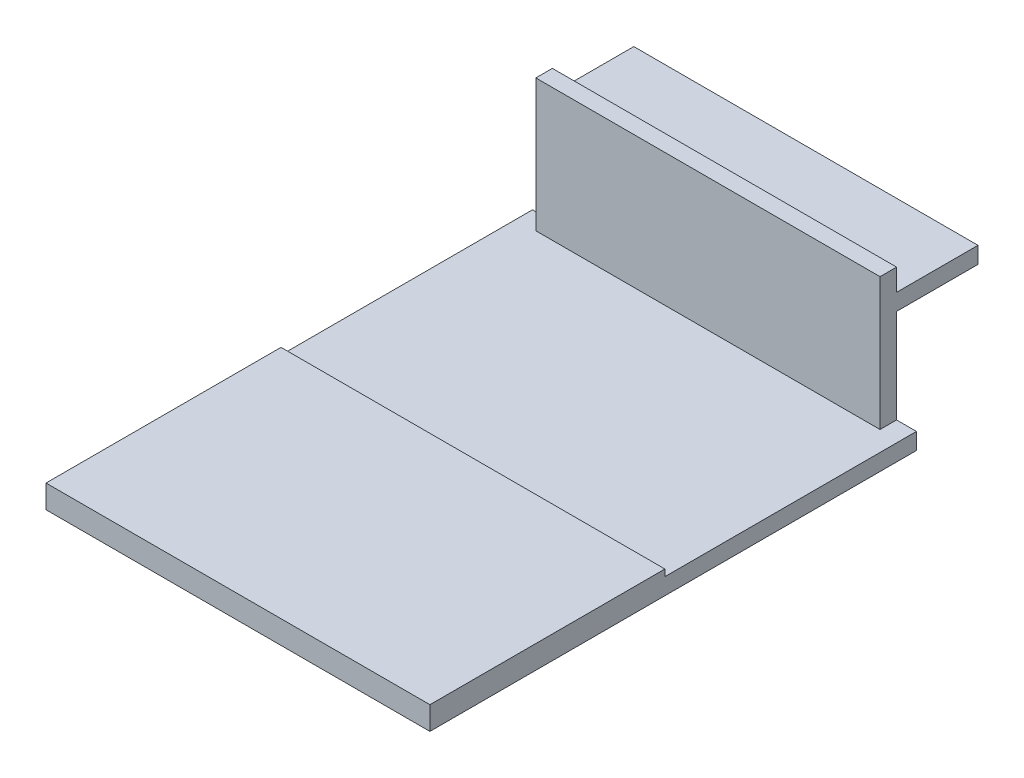
ISO-10303-21;
HEADER;
FILE_DESCRIPTION(('STEP AP214'),'2;1');
FILE_NAME('part.step','',(''),(''),'','','');
FILE_SCHEMA(('AUTOMOTIVE_DESIGN { 1 0 10303 214 1 1 1 1 }'));
ENDSEC;
DATA;
#1=APPLICATION_CONTEXT('core data for automotive mechanical design processes');
#2=APPLICATION_PROTOCOL_DEFINITION('international standard','automotive_design',2000,#1);
#3=PRODUCT_CONTEXT('',#1,'mechanical');
#4=PRODUCT('Part','Part','',(#3));
#5=PRODUCT_RELATED_PRODUCT_CATEGORY('part','',(#4));
#6=PRODUCT_DEFINITION_FORMATION('','',#4);
#7=PRODUCT_DEFINITION_CONTEXT('part definition',#1,'design');
#8=PRODUCT_DEFINITION('design','',#6,#7);
#9=PRODUCT_DEFINITION_SHAPE('','',#8);
#10=(LENGTH_UNIT() NAMED_UNIT(*) SI_UNIT(.MILLI.,.METRE.));
#11=(NAMED_UNIT(*) PLANE_ANGLE_UNIT() SI_UNIT($,.RADIAN.));
#12=(NAMED_UNIT(*) SI_UNIT($,.STERADIAN.) SOLID_ANGLE_UNIT());
#13=UNCERTAINTY_MEASURE_WITH_UNIT(LENGTH_MEASURE(1.E-05),#10,'distance_accuracy_value','');
#14=(GEOMETRIC_REPRESENTATION_CONTEXT(3) GLOBAL_UNCERTAINTY_ASSIGNED_CONTEXT((#13)) GLOBAL_UNIT_ASSIGNED_CONTEXT((#10,
#11,#12)) REPRESENTATION_CONTEXT('',''));
#15=CARTESIAN_POINT('',(0.,0.,0.));
#16=DIRECTION('',(0.,0.,1.));
#17=DIRECTION('',(1.,0.,0.));
#18=AXIS2_PLACEMENT_3D('',#15,#16,#17);
#19=CARTESIAN_POINT('',(-30.1473217032537,-33.3302843760966,186.69));
#20=DIRECTION('',(0.,-1.,0.));
#21=DIRECTION('',(0.,0.,-1.));
#22=AXIS2_PLACEMENT_3D('',#19,#20,#21);
#23=PLANE('',#22);
#24=DIRECTION('',(-1.,0.,0.));
#25=VECTOR('',#24,1.);
#26=CARTESIAN_POINT('',(-37.7673217032537,-33.3302843760966,96.52));
#27=LINE('',#26,#25);
#28=CARTESIAN_POINT('',(109.552678296746,-33.3302843760966,96.52));
#29=VERTEX_POINT('',#28);
#30=CARTESIAN_POINT('',(-37.7673217032537,-33.3302843760966,96.52));
#31=VERTEX_POINT('',#30);
#32=EDGE_CURVE('E173',#29,#31,#27,.T.);
#33=ORIENTED_EDGE('',*,*,#32,.F.);
#34=DIRECTION('',(0.,0.,1.));
#35=VECTOR('',#34,1.);
#36=CARTESIAN_POINT('',(109.552678296746,-33.3302843760966,0.));
#37=LINE('',#36,#35);
#38=CARTESIAN_POINT('',(109.552678296746,-33.3302843760966,0.));
#39=VERTEX_POINT('',#38);
#40=EDGE_CURVE('E191',#39,#29,#37,.T.);
#41=ORIENTED_EDGE('',*,*,#40,.F.);
#42=DIRECTION('',(1.,0.,0.));
#43=VECTOR('',#42,1.);
#44=CARTESIAN_POINT('',(101.932678296746,-33.3302843760966,0.));
#45=LINE('',#44,#43);
#46=CARTESIAN_POINT('',(101.932678296746,-33.3302843760966,0.));
#47=VERTEX_POINT('',#46);
#48=EDGE_CURVE('E56',#47,#39,#45,.T.);
#49=ORIENTED_EDGE('',*,*,#48,.F.);
#50=DIRECTION('',(0.,0.,-1.));
#51=VECTOR('',#50,1.);
#52=CARTESIAN_POINT('',(101.932678296746,-33.3302843760966,0.));
#53=LINE('',#52,#51);
#54=CARTESIAN_POINT('',(101.932678296746,-33.3302843760966,6.35));
#55=VERTEX_POINT('',#54);
#56=EDGE_CURVE('E11',#55,#47,#53,.T.);
#57=ORIENTED_EDGE('',*,*,#56,.F.);
#58=DIRECTION('',(-1.,0.,0.));
#59=VECTOR('',#58,1.);
#60=CARTESIAN_POINT('',(-30.1473217032537,-33.3302843760966,6.35));
#61=LINE('',#60,#59);
#62=CARTESIAN_POINT('',(-30.1473217032537,-33.3302843760966,6.35));
#63=VERTEX_POINT('',#62);
#64=EDGE_CURVE('E216',#55,#63,#61,.T.);
#65=ORIENTED_EDGE('',*,*,#64,.T.);
#66=DIRECTION('',(0.,0.,1.));
#67=VECTOR('',#66,1.);
#68=CARTESIAN_POINT('',(-30.1473217032537,-33.3302843760966,0.));
#69=LINE('',#68,#67);
#70=CARTESIAN_POINT('',(-30.1473217032537,-33.3302843760966,0.));
#71=VERTEX_POINT('',#70);
#72=EDGE_CURVE('E204',#71,#63,#69,.T.);
#73=ORIENTED_EDGE('',*,*,#72,.F.);
#74=DIRECTION('',(1.,0.,0.));
#75=VECTOR('',#74,1.);
#76=CARTESIAN_POINT('',(-30.1473217032537,-33.3302843760966,0.));
#77=LINE('',#76,#75);
#78=CARTESIAN_POINT('',(-37.7673217032537,-33.3302843760966,0.));
#79=VERTEX_POINT('',#78);
#80=EDGE_CURVE('E156',#79,#71,#77,.T.);
#81=ORIENTED_EDGE('',*,*,#80,.F.);
#82=DIRECTION('',(0.,0.,-1.));
#83=VECTOR('',#82,1.);
#84=CARTESIAN_POINT('',(-37.7673217032537,-33.3302843760966,0.));
#85=LINE('',#84,#83);
#86=EDGE_CURVE('E207',#31,#79,#85,.T.);
#87=ORIENTED_EDGE('',*,*,#86,.F.);
#88=EDGE_LOOP('',(#33,#41,#49,#57,#65,#73,#81,#87));
#89=FACE_BOUND('',#88,.T.);
#90=ADVANCED_FACE('F39',(#89),#23,.F.);
#91=CARTESIAN_POINT('',(0.,0.,0.));
#92=DIRECTION('',(0.,0.,1.));
#93=DIRECTION('',(1.,0.,0.));
#94=AXIS2_PLACEMENT_3D('',#91,#92,#93);
#95=PLANE('',#94);
#96=DIRECTION('',(1.,0.,0.));
#97=VECTOR('',#96,1.);
#98=CARTESIAN_POINT('',(101.932678296746,9.08771562390343,0.));
#99=LINE('',#98,#97);
#100=CARTESIAN_POINT('',(-30.1473217032537,9.08771562390343,0.));
#101=VERTEX_POINT('',#100);
#102=CARTESIAN_POINT('',(101.932678296746,9.08771562390343,0.));
#103=VERTEX_POINT('',#102);
#104=EDGE_CURVE('E229',#101,#103,#99,.T.);
#105=ORIENTED_EDGE('',*,*,#104,.F.);
#106=DIRECTION('',(0.,-1.,0.));
#107=VECTOR('',#106,1.);
#108=CARTESIAN_POINT('',(-30.1473217032537,17.4697156239034,0.));
#109=LINE('',#108,#107);
#110=CARTESIAN_POINT('',(-30.1473217032537,17.4697156239034,0.));
#111=VERTEX_POINT('',#110);
#112=EDGE_CURVE('E271',#111,#101,#109,.T.);
#113=ORIENTED_EDGE('',*,*,#112,.F.);
#114=DIRECTION('',(-1.,0.,0.));
#115=VECTOR('',#114,1.);
#116=CARTESIAN_POINT('',(-30.1473217032537,17.4697156239034,0.));
#117=LINE('',#116,#115);
#118=CARTESIAN_POINT('',(101.932678296746,17.4697156239034,0.));
#119=VERTEX_POINT('',#118);
#120=EDGE_CURVE('E264',#119,#111,#117,.T.);
#121=ORIENTED_EDGE('',*,*,#120,.F.);
#122=DIRECTION('',(0.,1.,0.));
#123=VECTOR('',#122,1.);
#124=CARTESIAN_POINT('',(101.932678296746,17.4697156239034,0.));
#125=LINE('',#124,#123);
#126=EDGE_CURVE('E278',#103,#119,#125,.T.);
#127=ORIENTED_EDGE('',*,*,#126,.F.);
#128=EDGE_LOOP('',(#105,#113,#121,#127));
#129=FACE_BOUND('',#128,.T.);
#130=ADVANCED_FACE('F298',(#129),#95,.F.);
#131=DIRECTION('',(-1.,0.,0.));
#132=VECTOR('',#131,1.);
#133=CARTESIAN_POINT('',(101.932678296746,2.73771562390344,0.));
#134=LINE('',#133,#132);
#135=CARTESIAN_POINT('',(101.932678296746,2.73771562390344,0.));
#136=VERTEX_POINT('',#135);
#137=CARTESIAN_POINT('',(-30.1473217032537,2.73771562390344,0.));
#138=VERTEX_POINT('',#137);
#139=EDGE_CURVE('E221',#136,#138,#134,.T.);
#140=ORIENTED_EDGE('',*,*,#139,.F.);
#141=EDGE_CURVE('E279',#47,#136,#125,.T.);
#142=ORIENTED_EDGE('',*,*,#141,.F.);
#143=ORIENTED_EDGE('',*,*,#48,.T.);
#144=DIRECTION('',(0.,-1.,0.));
#145=VECTOR('',#144,1.);
#146=CARTESIAN_POINT('',(109.552678296746,-33.3302843760966,0.));
#147=LINE('',#146,#145);
#148=CARTESIAN_POINT('',(109.552678296746,-39.6802843760966,0.));
#149=VERTEX_POINT('',#148);
#150=EDGE_CURVE('E195',#39,#149,#147,.T.);
#151=ORIENTED_EDGE('',*,*,#150,.T.);
#152=DIRECTION('',(1.,0.,0.));
#153=VECTOR('',#152,1.);
#154=CARTESIAN_POINT('',(-30.1473217032537,-39.6802843760966,0.));
#155=LINE('',#154,#153);
#156=CARTESIAN_POINT('',(-37.7673217032537,-39.6802843760966,0.));
#157=VERTEX_POINT('',#156);
#158=EDGE_CURVE('E275',#157,#149,#155,.T.);
#159=ORIENTED_EDGE('',*,*,#158,.F.);
#160=DIRECTION('',(0.,-1.,0.));
#161=VECTOR('',#160,1.);
#162=CARTESIAN_POINT('',(-37.7673217032537,-33.3302843760966,0.));
#163=LINE('',#162,#161);
#164=EDGE_CURVE('E155',#79,#157,#163,.T.);
#165=ORIENTED_EDGE('',*,*,#164,.F.);
#166=ORIENTED_EDGE('',*,*,#80,.T.);
#167=EDGE_CURVE('E63',#138,#71,#109,.T.);
#168=ORIENTED_EDGE('',*,*,#167,.F.);
#169=EDGE_LOOP('',(#140,#142,#143,#151,#159,#165,#166,#168));
#170=FACE_BOUND('',#169,.T.);
#171=ADVANCED_FACE('F315',(#170),#95,.F.);
#172=CARTESIAN_POINT('',(-30.1473217032537,17.4697156239034,6.35));
#173=DIRECTION('',(1.,0.,0.));
#174=DIRECTION('',(0.,1.,0.));
#175=AXIS2_PLACEMENT_3D('',#172,#173,#174);
#176=PLANE('',#175);
#177=ORIENTED_EDGE('',*,*,#167,.T.);
#178=ORIENTED_EDGE('',*,*,#72,.T.);
#179=DIRECTION('',(0.,-1.,0.));
#180=VECTOR('',#179,1.);
#181=CARTESIAN_POINT('',(-30.1473217032537,17.4697156239034,6.35));
#182=LINE('',#181,#180);
#183=CARTESIAN_POINT('',(-30.1473217032537,17.4697156239034,6.35));
#184=VERTEX_POINT('',#183);
#185=EDGE_CURVE('E259',#184,#63,#182,.T.);
#186=ORIENTED_EDGE('',*,*,#185,.F.);
#187=DIRECTION('',(0.,0.,-1.));
#188=VECTOR('',#187,1.);
#189=CARTESIAN_POINT('',(-30.1473217032537,17.4697156239034,6.35));
#190=LINE('',#189,#188);
#191=EDGE_CURVE('E270',#184,#111,#190,.T.);
#192=ORIENTED_EDGE('',*,*,#191,.T.);
#193=ORIENTED_EDGE('',*,*,#112,.T.);
#194=DIRECTION('',(0.,0.,1.));
#195=VECTOR('',#194,1.);
#196=CARTESIAN_POINT('',(-30.1473217032537,9.08771562390343,-31.242));
#197=LINE('',#196,#195);
#198=CARTESIAN_POINT('',(-30.1473217032537,9.08771562390343,-31.242));
#199=VERTEX_POINT('',#198);
#200=EDGE_CURVE('E248',#199,#101,#197,.T.);
#201=ORIENTED_EDGE('',*,*,#200,.F.);
#202=DIRECTION('',(0.,1.,0.));
#203=VECTOR('',#202,1.);
#204=CARTESIAN_POINT('',(-30.1473217032537,2.73771562390344,-31.242));
#205=LINE('',#204,#203);
#206=CARTESIAN_POINT('',(-30.1473217032537,2.73771562390344,-31.242));
#207=VERTEX_POINT('',#206);
#208=EDGE_CURVE('E232',#207,#199,#205,.T.);
#209=ORIENTED_EDGE('',*,*,#208,.F.);
#210=DIRECTION('',(0.,0.,1.));
#211=VECTOR('',#210,1.);
#212=CARTESIAN_POINT('',(-30.1473217032537,2.73771562390344,-31.242));
#213=LINE('',#212,#211);
#214=EDGE_CURVE('E252',#207,#138,#213,.T.);
#215=ORIENTED_EDGE('',*,*,#214,.T.);
#216=EDGE_LOOP('',(#177,#178,#186,#192,#193,#201,#209,#215));
#217=FACE_BOUND('',#216,.T.);
#218=ADVANCED_FACE('F41',(#217),#176,.F.);
#219=CARTESIAN_POINT('',(-30.1473217032537,-39.6802843760966,6.35));
#220=DIRECTION('',(0.,1.,0.));
#221=DIRECTION('',(0.,0.,1.));
#222=AXIS2_PLACEMENT_3D('',#219,#220,#221);
#223=PLANE('',#222);
#224=ORIENTED_EDGE('',*,*,#158,.T.);
#225=DIRECTION('',(0.,0.,1.));
#226=VECTOR('',#225,1.);
#227=CARTESIAN_POINT('',(109.552678296746,-39.6802843760966,0.));
#228=LINE('',#227,#226);
#229=CARTESIAN_POINT('',(109.552678296746,-39.6802843760966,186.69));
#230=VERTEX_POINT('',#229);
#231=EDGE_CURVE('E187',#149,#230,#228,.T.);
#232=ORIENTED_EDGE('',*,*,#231,.T.);
#233=DIRECTION('',(1.,0.,0.));
#234=VECTOR('',#233,1.);
#235=CARTESIAN_POINT('',(-30.1473217032537,-39.6802843760966,186.69));
#236=LINE('',#235,#234);
#237=CARTESIAN_POINT('',(-37.7673217032537,-39.6802843760966,186.69));
#238=VERTEX_POINT('',#237);
#239=EDGE_CURVE('E218',#238,#230,#236,.T.);
#240=ORIENTED_EDGE('',*,*,#239,.F.);
#241=DIRECTION('',(0.,0.,-1.));
#242=VECTOR('',#241,1.);
#243=CARTESIAN_POINT('',(-37.7673217032537,-39.6802843760966,0.));
#244=LINE('',#243,#242);
#245=EDGE_CURVE('E152',#238,#157,#244,.T.);
#246=ORIENTED_EDGE('',*,*,#245,.T.);
#247=EDGE_LOOP('',(#224,#232,#240,#246));
#248=FACE_BOUND('',#247,.T.);
#249=ADVANCED_FACE('F328',(#248),#223,.F.);
#250=CARTESIAN_POINT('',(101.932678296746,17.4697156239034,6.35));
#251=DIRECTION('',(-1.,0.,0.));
#252=DIRECTION('',(0.,0.,1.));
#253=AXIS2_PLACEMENT_3D('',#250,#251,#252);
#254=PLANE('',#253);
#255=DIRECTION('',(0.,1.,0.));
#256=VECTOR('',#255,1.);
#257=CARTESIAN_POINT('',(101.932678296746,17.4697156239034,6.35));
#258=LINE('',#257,#256);
#259=CARTESIAN_POINT('',(101.932678296746,17.4697156239034,6.35));
#260=VERTEX_POINT('',#259);
#261=EDGE_CURVE('E263',#55,#260,#258,.T.);
#262=ORIENTED_EDGE('',*,*,#261,.F.);
#263=ORIENTED_EDGE('',*,*,#56,.T.);
#264=ORIENTED_EDGE('',*,*,#141,.T.);
#265=DIRECTION('',(0.,0.,1.));
#266=VECTOR('',#265,1.);
#267=CARTESIAN_POINT('',(101.932678296746,2.73771562390344,-31.242));
#268=LINE('',#267,#266);
#269=CARTESIAN_POINT('',(101.932678296746,2.73771562390344,-31.242));
#270=VERTEX_POINT('',#269);
#271=EDGE_CURVE('E255',#270,#136,#268,.T.);
#272=ORIENTED_EDGE('',*,*,#271,.F.);
#273=DIRECTION('',(0.,-1.,0.));
#274=VECTOR('',#273,1.);
#275=CARTESIAN_POINT('',(101.932678296746,2.73771562390344,-31.242));
#276=LINE('',#275,#274);
#277=CARTESIAN_POINT('',(101.932678296746,9.08771562390343,-31.242));
#278=VERTEX_POINT('',#277);
#279=EDGE_CURVE('E224',#278,#270,#276,.T.);
#280=ORIENTED_EDGE('',*,*,#279,.F.);
#281=DIRECTION('',(0.,0.,1.));
#282=VECTOR('',#281,1.);
#283=CARTESIAN_POINT('',(101.932678296746,9.08771562390343,-31.242));
#284=LINE('',#283,#282);
#285=EDGE_CURVE('E238',#278,#103,#284,.T.);
#286=ORIENTED_EDGE('',*,*,#285,.T.);
#287=ORIENTED_EDGE('',*,*,#126,.T.);
#288=DIRECTION('',(0.,0.,-1.));
#289=VECTOR('',#288,1.);
#290=CARTESIAN_POINT('',(101.932678296746,17.4697156239034,6.35));
#291=LINE('',#290,#289);
#292=EDGE_CURVE('E43',#260,#119,#291,.T.);
#293=ORIENTED_EDGE('',*,*,#292,.F.);
#294=EDGE_LOOP('',(#262,#263,#264,#272,#280,#286,#287,#293));
#295=FACE_BOUND('',#294,.T.);
#296=ADVANCED_FACE('F320',(#295),#254,.F.);
#297=CARTESIAN_POINT('',(-30.1473217032537,17.4697156239034,6.35));
#298=DIRECTION('',(0.,-1.,0.));
#299=DIRECTION('',(0.,0.,-1.));
#300=AXIS2_PLACEMENT_3D('',#297,#298,#299);
#301=PLANE('',#300);
#302=ORIENTED_EDGE('',*,*,#120,.T.);
#303=ORIENTED_EDGE('',*,*,#191,.F.);
#304=DIRECTION('',(-1.,0.,0.));
#305=VECTOR('',#304,1.);
#306=CARTESIAN_POINT('',(-30.1473217032537,17.4697156239034,6.35));
#307=LINE('',#306,#305);
#308=EDGE_CURVE('E267',#260,#184,#307,.T.);
#309=ORIENTED_EDGE('',*,*,#308,.F.);
#310=ORIENTED_EDGE('',*,*,#292,.T.);
#311=EDGE_LOOP('',(#302,#303,#309,#310));
#312=FACE_BOUND('',#311,.T.);
#313=ADVANCED_FACE('F294',(#312),#301,.F.);
#314=CARTESIAN_POINT('',(0.,0.,6.35));
#315=DIRECTION('',(0.,0.,1.));
#316=DIRECTION('',(1.,0.,0.));
#317=AXIS2_PLACEMENT_3D('',#314,#315,#316);
#318=PLANE('',#317);
#319=ORIENTED_EDGE('',*,*,#64,.F.);
#320=ORIENTED_EDGE('',*,*,#261,.T.);
#321=ORIENTED_EDGE('',*,*,#308,.T.);
#322=ORIENTED_EDGE('',*,*,#185,.T.);
#323=EDGE_LOOP('',(#319,#320,#321,#322));
#324=FACE_BOUND('',#323,.T.);
#325=ADVANCED_FACE('F324',(#324),#318,.T.);
#326=CARTESIAN_POINT('',(101.932678296746,2.73771562390344,-31.242));
#327=DIRECTION('',(0.,1.,0.));
#328=DIRECTION('',(0.,0.,1.));
#329=AXIS2_PLACEMENT_3D('',#326,#327,#328);
#330=PLANE('',#329);
#331=ORIENTED_EDGE('',*,*,#139,.T.);
#332=ORIENTED_EDGE('',*,*,#214,.F.);
#333=DIRECTION('',(-1.,0.,0.));
#334=VECTOR('',#333,1.);
#335=CARTESIAN_POINT('',(101.932678296746,2.73771562390344,-31.242));
#336=LINE('',#335,#334);
#337=EDGE_CURVE('E228',#270,#207,#336,.T.);
#338=ORIENTED_EDGE('',*,*,#337,.F.);
#339=ORIENTED_EDGE('',*,*,#271,.T.);
#340=EDGE_LOOP('',(#331,#332,#338,#339));
#341=FACE_BOUND('',#340,.T.);
#342=ADVANCED_FACE('F311',(#341),#330,.F.);
#343=CARTESIAN_POINT('',(101.932678296746,9.08771562390343,-31.242));
#344=DIRECTION('',(0.,-1.,0.));
#345=DIRECTION('',(1.,0.,0.));
#346=AXIS2_PLACEMENT_3D('',#343,#344,#345);
#347=PLANE('',#346);
#348=ORIENTED_EDGE('',*,*,#104,.T.);
#349=ORIENTED_EDGE('',*,*,#285,.F.);
#350=DIRECTION('',(1.,0.,0.));
#351=VECTOR('',#350,1.);
#352=CARTESIAN_POINT('',(101.932678296746,9.08771562390343,-31.242));
#353=LINE('',#352,#351);
#354=EDGE_CURVE('E235',#199,#278,#353,.T.);
#355=ORIENTED_EDGE('',*,*,#354,.F.);
#356=ORIENTED_EDGE('',*,*,#200,.T.);
#357=EDGE_LOOP('',(#348,#349,#355,#356));
#358=FACE_BOUND('',#357,.T.);
#359=ADVANCED_FACE('F303',(#358),#347,.F.);
#360=CARTESIAN_POINT('',(0.,0.,-31.242));
#361=DIRECTION('',(0.,0.,1.));
#362=DIRECTION('',(1.,0.,0.));
#363=AXIS2_PLACEMENT_3D('',#360,#361,#362);
#364=PLANE('',#363);
#365=ORIENTED_EDGE('',*,*,#279,.T.);
#366=ORIENTED_EDGE('',*,*,#337,.T.);
#367=ORIENTED_EDGE('',*,*,#208,.T.);
#368=ORIENTED_EDGE('',*,*,#354,.T.);
#369=EDGE_LOOP('',(#365,#366,#367,#368));
#370=FACE_BOUND('',#369,.T.);
#371=ADVANCED_FACE('F307',(#370),#364,.F.);
#372=CARTESIAN_POINT('',(0.,0.,186.69));
#373=DIRECTION('',(0.,0.,-1.));
#374=DIRECTION('',(-1.,0.,0.));
#375=AXIS2_PLACEMENT_3D('',#372,#373,#374);
#376=PLANE('',#375);
#377=DIRECTION('',(0.,-1.,0.));
#378=VECTOR('',#377,1.);
#379=CARTESIAN_POINT('',(109.552678296746,-33.3302843760966,186.69));
#380=LINE('',#379,#378);
#381=CARTESIAN_POINT('',(109.552678296746,-30.7902843760966,186.69));
#382=VERTEX_POINT('',#381);
#383=EDGE_CURVE('E162',#382,#230,#380,.T.);
#384=ORIENTED_EDGE('',*,*,#383,.F.);
#385=DIRECTION('',(1.,0.,0.));
#386=VECTOR('',#385,1.);
#387=CARTESIAN_POINT('',(-37.7673217032537,-30.7902843760966,186.69));
#388=LINE('',#387,#386);
#389=CARTESIAN_POINT('',(-37.7673217032537,-30.7902843760966,186.69));
#390=VERTEX_POINT('',#389);
#391=EDGE_CURVE('E159',#390,#382,#388,.T.);
#392=ORIENTED_EDGE('',*,*,#391,.F.);
#393=DIRECTION('',(0.,-1.,0.));
#394=VECTOR('',#393,1.);
#395=CARTESIAN_POINT('',(-37.7673217032537,-33.3302843760966,186.69));
#396=LINE('',#395,#394);
#397=EDGE_CURVE('E144',#390,#238,#396,.T.);
#398=ORIENTED_EDGE('',*,*,#397,.T.);
#399=ORIENTED_EDGE('',*,*,#239,.T.);
#400=EDGE_LOOP('',(#384,#392,#398,#399));
#401=FACE_BOUND('',#400,.T.);
#402=ADVANCED_FACE('F160',(#401),#376,.F.);
#403=CARTESIAN_POINT('',(-37.7673217032537,-33.3302843760966,0.));
#404=DIRECTION('',(-1.,0.,0.));
#405=DIRECTION('',(0.,0.,1.));
#406=AXIS2_PLACEMENT_3D('',#403,#404,#405);
#407=PLANE('',#406);
#408=ORIENTED_EDGE('',*,*,#245,.F.);
#409=ORIENTED_EDGE('',*,*,#397,.F.);
#410=DIRECTION('',(0.,0.,1.));
#411=VECTOR('',#410,1.);
#412=CARTESIAN_POINT('',(-37.7673217032537,-30.7902843760966,96.52));
#413=LINE('',#412,#411);
#414=CARTESIAN_POINT('',(-37.7673217032537,-30.7902843760966,96.52));
#415=VERTEX_POINT('',#414);
#416=EDGE_CURVE('E149',#415,#390,#413,.T.);
#417=ORIENTED_EDGE('',*,*,#416,.F.);
#418=DIRECTION('',(0.,-1.,0.));
#419=VECTOR('',#418,1.);
#420=CARTESIAN_POINT('',(-37.7673217032537,-30.7902843760966,96.52));
#421=LINE('',#420,#419);
#422=EDGE_CURVE('E181',#415,#31,#421,.T.);
#423=ORIENTED_EDGE('',*,*,#422,.T.);
#424=ORIENTED_EDGE('',*,*,#86,.T.);
#425=ORIENTED_EDGE('',*,*,#164,.T.);
#426=EDGE_LOOP('',(#408,#409,#417,#423,#424,#425));
#427=FACE_BOUND('',#426,.T.);
#428=ADVANCED_FACE('F146',(#427),#407,.T.);
#429=CARTESIAN_POINT('',(109.552678296746,-33.3302843760966,0.));
#430=DIRECTION('',(1.,0.,0.));
#431=DIRECTION('',(0.,0.,-1.));
#432=AXIS2_PLACEMENT_3D('',#429,#430,#431);
#433=PLANE('',#432);
#434=ORIENTED_EDGE('',*,*,#231,.F.);
#435=ORIENTED_EDGE('',*,*,#150,.F.);
#436=ORIENTED_EDGE('',*,*,#40,.T.);
#437=DIRECTION('',(0.,-1.,0.));
#438=VECTOR('',#437,1.);
#439=CARTESIAN_POINT('',(109.552678296746,-30.7902843760966,96.52));
#440=LINE('',#439,#438);
#441=CARTESIAN_POINT('',(109.552678296746,-30.7902843760966,96.52));
#442=VERTEX_POINT('',#441);
#443=EDGE_CURVE('E185',#442,#29,#440,.T.);
#444=ORIENTED_EDGE('',*,*,#443,.F.);
#445=DIRECTION('',(0.,0.,-1.));
#446=VECTOR('',#445,1.);
#447=CARTESIAN_POINT('',(109.552678296746,-30.7902843760966,96.52));
#448=LINE('',#447,#446);
#449=EDGE_CURVE('E166',#382,#442,#448,.T.);
#450=ORIENTED_EDGE('',*,*,#449,.F.);
#451=ORIENTED_EDGE('',*,*,#383,.T.);
#452=EDGE_LOOP('',(#434,#435,#436,#444,#450,#451));
#453=FACE_BOUND('',#452,.T.);
#454=ADVANCED_FACE('F330',(#453),#433,.T.);
#455=CARTESIAN_POINT('',(-37.7673217032537,-30.7902843760966,96.52));
#456=DIRECTION('',(0.,0.,1.));
#457=DIRECTION('',(1.,0.,0.));
#458=AXIS2_PLACEMENT_3D('',#455,#456,#457);
#459=PLANE('',#458);
#460=ORIENTED_EDGE('',*,*,#32,.T.);
#461=ORIENTED_EDGE('',*,*,#422,.F.);
#462=DIRECTION('',(-1.,0.,0.));
#463=VECTOR('',#462,1.);
#464=CARTESIAN_POINT('',(-37.7673217032537,-30.7902843760966,96.52));
#465=LINE('',#464,#463);
#466=EDGE_CURVE('E170',#442,#415,#465,.T.);
#467=ORIENTED_EDGE('',*,*,#466,.F.);
#468=ORIENTED_EDGE('',*,*,#443,.T.);
#469=EDGE_LOOP('',(#460,#461,#467,#468));
#470=FACE_BOUND('',#469,.T.);
#471=ADVANCED_FACE('F333',(#470),#459,.F.);
#472=CARTESIAN_POINT('',(0.,-30.7902843760966,0.));
#473=DIRECTION('',(0.,1.,0.));
#474=DIRECTION('',(0.,0.,1.));
#475=AXIS2_PLACEMENT_3D('',#472,#473,#474);
#476=PLANE('',#475);
#477=ORIENTED_EDGE('',*,*,#416,.T.);
#478=ORIENTED_EDGE('',*,*,#391,.T.);
#479=ORIENTED_EDGE('',*,*,#449,.T.);
#480=ORIENTED_EDGE('',*,*,#466,.T.);
#481=EDGE_LOOP('',(#477,#478,#479,#480));
#482=FACE_BOUND('',#481,.T.);
#483=ADVANCED_FACE('F168',(#482),#476,.T.);
#484=CLOSED_SHELL('',(#90,#130,#171,#218,#249,#296,#313,#325,#342,#359,#371,#402,#428,#454,#471,#483));
#485=MANIFOLD_SOLID_BREP('B2',#484);
#486=ADVANCED_BREP_SHAPE_REPRESENTATION('',(#18,#485),#14);
#487=SHAPE_DEFINITION_REPRESENTATION(#9,#486);
ENDSEC;
END-ISO-10303-21;
